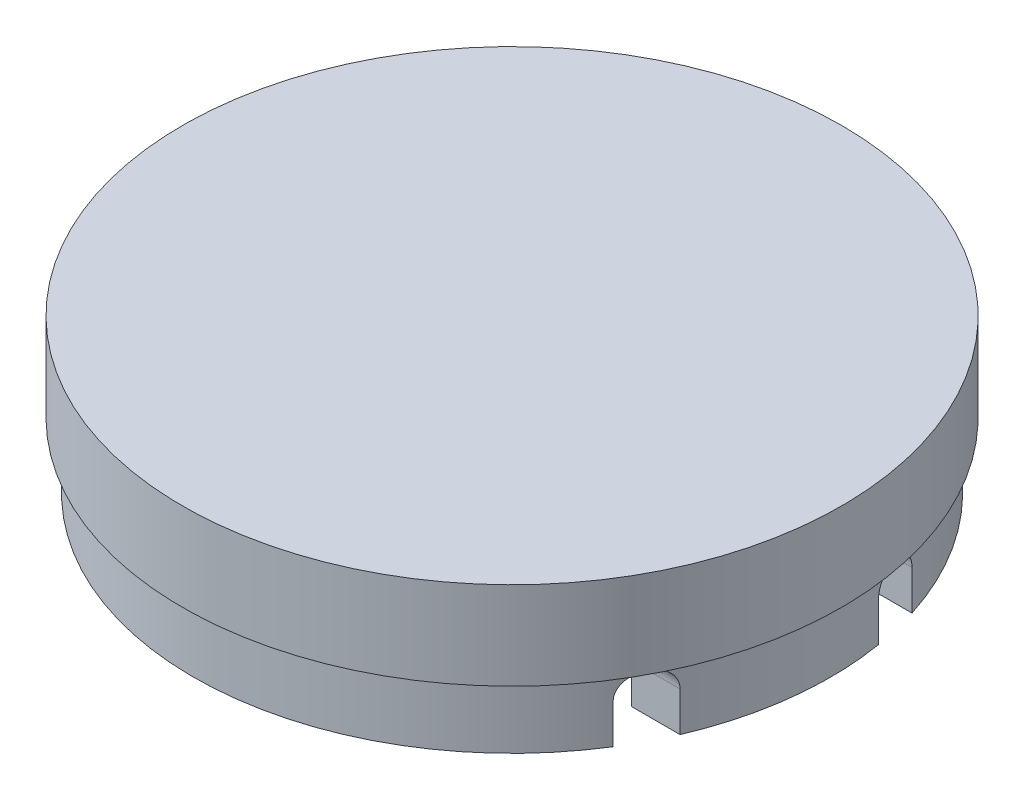
ISO-10303-21;
HEADER;
FILE_DESCRIPTION(('STEP AP214'),'2;1');
FILE_NAME('part.step','',(''),(''),'','','');
FILE_SCHEMA(('AUTOMOTIVE_DESIGN { 1 0 10303 214 1 1 1 1 }'));
ENDSEC;
DATA;
#1=APPLICATION_CONTEXT('core data for automotive mechanical design processes');
#2=APPLICATION_PROTOCOL_DEFINITION('international standard','automotive_design',2000,#1);
#3=PRODUCT_CONTEXT('',#1,'mechanical');
#4=PRODUCT('Part','Part','',(#3));
#5=PRODUCT_RELATED_PRODUCT_CATEGORY('part','',(#4));
#6=PRODUCT_DEFINITION_FORMATION('','',#4);
#7=PRODUCT_DEFINITION_CONTEXT('part definition',#1,'design');
#8=PRODUCT_DEFINITION('design','',#6,#7);
#9=PRODUCT_DEFINITION_SHAPE('','',#8);
#10=(LENGTH_UNIT() NAMED_UNIT(*) SI_UNIT(.MILLI.,.METRE.));
#11=(NAMED_UNIT(*) PLANE_ANGLE_UNIT() SI_UNIT($,.RADIAN.));
#12=(NAMED_UNIT(*) SI_UNIT($,.STERADIAN.) SOLID_ANGLE_UNIT());
#13=UNCERTAINTY_MEASURE_WITH_UNIT(LENGTH_MEASURE(1.E-05),#10,'distance_accuracy_value','');
#14=(GEOMETRIC_REPRESENTATION_CONTEXT(3) GLOBAL_UNCERTAINTY_ASSIGNED_CONTEXT((#13)) GLOBAL_UNIT_ASSIGNED_CONTEXT((#10,
#11,#12)) REPRESENTATION_CONTEXT('',''));
#15=CARTESIAN_POINT('',(0.,0.,0.));
#16=DIRECTION('',(0.,0.,1.));
#17=DIRECTION('',(1.,0.,0.));
#18=AXIS2_PLACEMENT_3D('',#15,#16,#17);
#19=CARTESIAN_POINT('',(0.,0.,0.));
#20=DIRECTION('',(0.,-1.,0.));
#21=DIRECTION('',(0.,0.,-1.));
#22=AXIS2_PLACEMENT_3D('',#19,#20,#21);
#23=PLANE('',#22);
#24=CARTESIAN_POINT('',(0.,0.,0.));
#25=DIRECTION('',(0.,-1.,0.));
#26=DIRECTION('',(0.,0.,-1.));
#27=AXIS2_PLACEMENT_3D('',#24,#25,#26);
#28=CIRCLE('',#27,92.075);
#29=CARTESIAN_POINT('',(78.0603424756711,0.,48.8302012854845));
#30=VERTEX_POINT('',#29);
#31=CARTESIAN_POINT('',(87.7774272459443,0.,-27.8015987145155));
#32=VERTEX_POINT('',#31);
#33=EDGE_CURVE('E11',#30,#32,#28,.T.);
#34=ORIENTED_EDGE('',*,*,#33,.T.);
#35=DIRECTION('',(1.,0.,0.));
#36=VECTOR('',#35,1.);
#37=CARTESIAN_POINT('',(95.251,0.,-27.8015987145155));
#38=LINE('',#37,#36);
#39=CARTESIAN_POINT('',(74.3469013067596,0.,-27.8015987145155));
#40=VERTEX_POINT('',#39);
#41=EDGE_CURVE('E101',#40,#32,#38,.T.);
#42=ORIENTED_EDGE('',*,*,#41,.F.);
#43=CARTESIAN_POINT('',(0.,0.,0.));
#44=DIRECTION('',(0.,-1.,0.));
#45=DIRECTION('',(0.,0.,-1.));
#46=AXIS2_PLACEMENT_3D('',#43,#44,#45);
#47=CIRCLE('',#46,79.375);
#48=CARTESIAN_POINT('',(62.5779679073959,0.,48.8302012854845));
#49=VERTEX_POINT('',#48);
#50=EDGE_CURVE('E113',#49,#40,#47,.T.);
#51=ORIENTED_EDGE('',*,*,#50,.F.);
#52=DIRECTION('',(-1.,0.,0.));
#53=VECTOR('',#52,1.);
#54=CARTESIAN_POINT('',(95.251,0.,48.8302012854845));
#55=LINE('',#54,#53);
#56=EDGE_CURVE('E56',#30,#49,#55,.T.);
#57=ORIENTED_EDGE('',*,*,#56,.F.);
#58=EDGE_LOOP('',(#34,#42,#51,#57));
#59=FACE_BOUND('',#58,.T.);
#60=ADVANCED_FACE('F34',(#59),#23,.T.);
#61=CARTESIAN_POINT('',(77.9251714227549,0.,-15.1015987145155));
#62=VERTEX_POINT('',#61);
#63=CARTESIAN_POINT('',(70.6753081356592,0.,36.1302012854845));
#64=VERTEX_POINT('',#63);
#65=EDGE_CURVE('E122',#62,#64,#47,.T.);
#66=ORIENTED_EDGE('',*,*,#65,.F.);
#67=DIRECTION('',(-1.,0.,0.));
#68=VECTOR('',#67,1.);
#69=CARTESIAN_POINT('',(95.251,0.,-15.1015987145155));
#70=LINE('',#69,#68);
#71=CARTESIAN_POINT('',(90.8281197717191,0.,-15.1015987145155));
#72=VERTEX_POINT('',#71);
#73=EDGE_CURVE('E48',#72,#62,#70,.T.);
#74=ORIENTED_EDGE('',*,*,#73,.F.);
#75=CARTESIAN_POINT('',(84.6901067425846,0.,36.1302012854845));
#76=VERTEX_POINT('',#75);
#77=EDGE_CURVE('E41',#72,#76,#28,.T.);
#78=ORIENTED_EDGE('',*,*,#77,.T.);
#79=DIRECTION('',(1.,0.,0.));
#80=VECTOR('',#79,1.);
#81=CARTESIAN_POINT('',(95.251,0.,36.1302012854845));
#82=LINE('',#81,#80);
#83=EDGE_CURVE('E142',#64,#76,#82,.T.);
#84=ORIENTED_EDGE('',*,*,#83,.F.);
#85=EDGE_LOOP('',(#66,#74,#78,#84));
#86=FACE_BOUND('',#85,.T.);
#87=ADVANCED_FACE('F141',(#86),#23,.T.);
#88=CARTESIAN_POINT('',(0.,0.,0.));
#89=DIRECTION('',(0.,-1.,0.));
#90=DIRECTION('',(0.,0.,-1.));
#91=AXIS2_PLACEMENT_3D('',#88,#89,#90);
#92=CYLINDRICAL_SURFACE('',#91,92.075);
#93=CARTESIAN_POINT('',(0.,19.05,0.));
#94=DIRECTION('',(0.,-1.,0.));
#95=DIRECTION('',(0.,0.,-1.));
#96=AXIS2_PLACEMENT_3D('',#93,#94,#95);
#97=CIRCLE('',#96,92.075);
#98=CARTESIAN_POINT('',(0.,19.05,-92.075));
#99=VERTEX_POINT('',#98);
#100=EDGE_CURVE('E132',#99,#99,#97,.T.);
#101=ORIENTED_EDGE('',*,*,#100,.T.);
#102=EDGE_LOOP('',(#101));
#103=FACE_BOUND('',#102,.T.);
#104=CARTESIAN_POINT('',(87.7774272459444,11.43,-27.8015987145155));
#105=CARTESIAN_POINT('',(87.7774159058502,11.6029773225166,-27.801622050643));
#106=CARTESIAN_POINT('',(87.7796654334244,11.7759480728997,-27.7945317603055));
#107=CARTESIAN_POINT('',(87.7886034667052,12.1205957592313,-27.7662948665976));
#108=CARTESIAN_POINT('',(87.7952912523624,12.2922729004826,-27.7451505433095));
#109=CARTESIAN_POINT('',(87.8130040535642,12.6327436287871,-27.6890367419301));
#110=CARTESIAN_POINT('',(87.8240197235096,12.8015426168132,-27.6540970526421));
#111=CARTESIAN_POINT('',(87.8502318215,13.1354393469028,-27.5707147996241));
#112=CARTESIAN_POINT('',(87.8654282941223,13.3005370494816,-27.52227209192));
#113=CARTESIAN_POINT('',(87.8997915995888,13.6258394943117,-27.4123251644539));
#114=CARTESIAN_POINT('',(87.9189572319075,13.7860456992887,-27.3508248939851));
#115=CARTESIAN_POINT('',(87.9610180893906,14.1006068106164,-27.2152523058838));
#116=CARTESIAN_POINT('',(87.9839146932102,14.254959527918,-27.1411753405304));
#117=CARTESIAN_POINT('',(88.0331401283024,14.5567342629933,-26.9810835920225));
#118=CARTESIAN_POINT('',(88.0594683799104,14.7041574455755,-26.8950708248727));
#119=CARTESIAN_POINT('',(88.1152538385358,14.9912462185714,-26.7117361240038));
#120=CARTESIAN_POINT('',(88.1447122253705,15.1309088534399,-26.6144099246931));
#121=CARTESIAN_POINT('',(88.2070967866769,15.4045915555596,-26.4069250606313));
#122=CARTESIAN_POINT('',(88.2400853250482,15.5384180890382,-26.2965298861126));
#123=CARTESIAN_POINT('',(88.3086091261689,15.7962915128639,-26.0654886728753));
#124=CARTESIAN_POINT('',(88.3441453161818,15.9203348075738,-25.9448388988162));
#125=CARTESIAN_POINT('',(88.4173681220934,16.1578620637483,-25.6941954358871));
#126=CARTESIAN_POINT('',(88.4550544735034,16.2713473194459,-25.5642028957508));
#127=CARTESIAN_POINT('',(88.5322133009518,16.4871811461961,-25.2956982615994));
#128=CARTESIAN_POINT('',(88.5716864419185,16.5895255222801,-25.1571829889659));
#129=CARTESIAN_POINT('',(88.6537060817536,16.7864982018879,-24.8666391598918));
#130=CARTESIAN_POINT('',(88.6963120896942,16.8806260055819,-24.7142878692818));
#131=CARTESIAN_POINT('',(88.7826336870014,17.0556044364281,-24.4023722980746));
#132=CARTESIAN_POINT('',(88.8263496630971,17.1364503606077,-24.2428054879333));
#133=CARTESIAN_POINT('',(88.914467567013,17.2843364855654,-23.9175972345723));
#134=CARTESIAN_POINT('',(88.9588694385033,17.3513778136476,-23.7519562886783));
#135=CARTESIAN_POINT('',(89.0479727252286,17.4712512965294,-23.4156877366158));
#136=CARTESIAN_POINT('',(89.0926741447528,17.524083247416,-23.2450600589237));
#137=CARTESIAN_POINT('',(89.1832139334126,17.6164290330638,-22.8952721120052));
#138=CARTESIAN_POINT('',(89.2290503511205,17.6555439836108,-22.7160058836635));
#139=CARTESIAN_POINT('',(89.320251203974,17.7181231258022,-22.3547098216815));
#140=CARTESIAN_POINT('',(89.3656157910972,17.7415925209261,-22.1726809274834));
#141=CARTESIAN_POINT('',(89.4555529692983,17.7727027556085,-21.8069973702445));
#142=CARTESIAN_POINT('',(89.5001252182054,17.7803369138262,-21.6233420537768));
#143=CARTESIAN_POINT('',(89.5881120879099,17.7796404133045,-21.2558575492247));
#144=CARTESIAN_POINT('',(89.6315271481618,17.7713159052089,-21.0720284554083));
#145=CARTESIAN_POINT('',(89.7169417961548,17.7386851718427,-20.7053480460103));
#146=CARTESIAN_POINT('',(89.7589405548451,17.7143697511184,-20.5224973540787));
#147=CARTESIAN_POINT('',(89.8412099761212,17.6498443555464,-20.1592974595501));
#148=CARTESIAN_POINT('',(89.8814812647037,17.6096401932977,-19.9789473671019));
#149=CARTESIAN_POINT('',(89.9600765145855,17.5135272147936,-19.6220197364076));
#150=CARTESIAN_POINT('',(89.9984002341428,17.4576164545522,-19.4454426680568));
#151=CARTESIAN_POINT('',(90.0728844892626,17.3304085779802,-19.0974544475254));
#152=CARTESIAN_POINT('',(90.1090451167968,17.259112116422,-18.9260430758608));
#153=CARTESIAN_POINT('',(90.1783601929469,17.10307179756,-18.592938748421));
#154=CARTESIAN_POINT('',(90.2115587744235,17.0186098670714,-18.4311228860619));
#155=CARTESIAN_POINT('',(90.2755653306973,16.8358365828349,-18.1150196226213));
#156=CARTESIAN_POINT('',(90.3063734039383,16.7375257998671,-17.9607319116198));
#157=CARTESIAN_POINT('',(90.3654911963782,16.5276957929002,-17.6608885174689));
#158=CARTESIAN_POINT('',(90.3938007374513,16.4161756285001,-17.5153334571261));
#159=CARTESIAN_POINT('',(90.4478230736426,16.1807464546504,-17.2341931204911));
#160=CARTESIAN_POINT('',(90.4735369135843,16.0568424702353,-17.0986038387899));
#161=CARTESIAN_POINT('',(90.5217648945671,15.8004355626413,-16.8413907413855));
#162=CARTESIAN_POINT('',(90.5443384074261,15.6681916030377,-16.7195198206864));
#163=CARTESIAN_POINT('',(90.5869120150263,15.3936487220564,-16.4872960519546));
#164=CARTESIAN_POINT('',(90.6069130795319,15.2513536212942,-16.3769388664412));
#165=CARTESIAN_POINT('',(90.6443363988574,14.9576126929604,-16.1685226073644));
#166=CARTESIAN_POINT('',(90.6617575492904,14.8061629854045,-16.0704688032511));
#167=CARTESIAN_POINT('',(90.6939994952155,14.4952662292374,-15.8875018271758));
#168=CARTESIAN_POINT('',(90.7088203918952,14.335819492137,-15.802588143888));
#169=CARTESIAN_POINT('',(90.7356436248908,14.0127066958505,-15.647832825724));
#170=CARTESIAN_POINT('',(90.7476873698687,13.8491493855031,-15.5777712181648));
#171=CARTESIAN_POINT('',(90.769259775502,13.5165897426794,-15.4515761651176));
#172=CARTESIAN_POINT('',(90.7787885181242,13.3475875878584,-15.3954422657127));
#173=CARTESIAN_POINT('',(90.7953271283391,13.0055748761487,-15.2976029921785));
#174=CARTESIAN_POINT('',(90.8023401933654,12.8325697071235,-15.2558793051552));
#175=CARTESIAN_POINT('',(90.8138686366863,12.4836563984965,-15.1871033049781));
#176=CARTESIAN_POINT('',(90.8183852269397,12.3077497102805,-15.1600438729217));
#177=CARTESIAN_POINT('',(90.8238142062272,12.0145707439693,-15.1274772230202));
#178=CARTESIAN_POINT('',(90.8254304566654,11.8977613636911,-15.1177670653845));
#179=CARTESIAN_POINT('',(90.8275821674246,11.6639719267477,-15.1048321754587));
#180=CARTESIAN_POINT('',(90.8281194467414,11.5469924906082,-15.1015965280753));
#181=CARTESIAN_POINT('',(90.8281197717191,11.43,-15.1015987145155));
#182=B_SPLINE_CURVE_WITH_KNOTS('',3,(#104,#105,#106,#107,#108,#109,#110,#111,#112,#113,#114,
#115,#116,#117,#118,#119,#120,#121,#122,#123,#124,#125,#126,#127,#128,#129,#130,#131,#132,#133,
#134,#135,#136,#137,#138,#139,#140,#141,#142,#143,#144,#145,#146,#147,#148,#149,#150,#151,#152,
#153,#154,#155,#156,#157,#158,#159,#160,#161,#162,#163,#164,#165,#166,#167,#168,#169,#170,#171,
#172,#173,#174,#175,#176,#177,#178,#179,#180,#181),.UNSPECIFIED.,.F.,.F.,(4,2,2,2,2,2,2,2,2,2,2,
2,2,2,2,2,2,2,2,2,2,2,2,2,2,2,2,2,2,2,2,2,2,2,2,2,2,2,4),(0.,0.518762110680606,1.03744007955425,
1.55500412148674,2.07257368209039,2.58998692489126,3.10759179575847,3.62510934725822,
4.14282265921749,4.67200460192008,5.20138013739801,5.73069069484398,6.26019987359708,
6.81181479573645,7.36362461983603,7.91538936442865,8.4671620267529,9.03385918118179,
9.60036776638743,10.1671153292367,10.7336445053148,11.3004997449165,11.8671478028028,
12.4338660249301,13.0005601338708,13.5564629181198,14.1123427975465,14.6682622749273,
15.2239570833521,15.7670406989817,16.3099189785041,16.8530289809784,17.3961178439234,
17.9304927573558,18.4648502527321,18.9985261513961,19.531942739384,19.8834414350701,
20.2343470535552),.UNSPECIFIED.);
#183=CARTESIAN_POINT('',(87.7774272459444,11.43,-27.8015987145155));
#184=VERTEX_POINT('',#183);
#185=CARTESIAN_POINT('',(90.8281197717191,11.43,-15.1015987145155));
#186=VERTEX_POINT('',#185);
#187=EDGE_CURVE('E108',#184,#186,#182,.T.);
#188=ORIENTED_EDGE('',*,*,#187,.F.);
#189=DIRECTION('',(0.,-1.,0.));
#190=VECTOR('',#189,1.);
#191=CARTESIAN_POINT('',(87.7774272459444,0.,-27.8015987145155));
#192=LINE('',#191,#190);
#193=EDGE_CURVE('E116',#32,#184,#192,.F.);
#194=ORIENTED_EDGE('',*,*,#193,.F.);
#195=ORIENTED_EDGE('',*,*,#33,.F.);
#196=DIRECTION('',(0.,-1.,0.));
#197=VECTOR('',#196,1.);
#198=CARTESIAN_POINT('',(78.0603424756711,0.,48.8302012854845));
#199=LINE('',#198,#197);
#200=CARTESIAN_POINT('',(78.0603424756711,11.43,48.8302012854845));
#201=VERTEX_POINT('',#200);
#202=EDGE_CURVE('E175',#201,#30,#199,.T.);
#203=ORIENTED_EDGE('',*,*,#202,.F.);
#204=CARTESIAN_POINT('',(84.6901067425846,11.43,36.1302012854845));
#205=CARTESIAN_POINT('',(84.6901137409722,11.5977208667609,36.1301757821111));
#206=CARTESIAN_POINT('',(84.6872722652147,11.7654347258229,36.1368451047794));
#207=CARTESIAN_POINT('',(84.6759438180474,12.0995924007407,36.1633868311557));
#208=CARTESIAN_POINT('',(84.667457890509,12.2660364456771,36.1832567935683));
#209=CARTESIAN_POINT('',(84.6449214276481,12.5960298686397,36.2359444578249));
#210=CARTESIAN_POINT('',(84.6308854844793,12.7595856717843,36.2687282057677));
#211=CARTESIAN_POINT('',(84.5973459314827,13.0830860049913,36.3468912699654));
#212=CARTESIAN_POINT('',(84.5778422481335,13.2430304864631,36.3922707555875));
#213=CARTESIAN_POINT('',(84.5335060137548,13.5581401466733,36.4951382328827));
#214=CARTESIAN_POINT('',(84.508675632742,13.7133072422985,36.5526212935654));
#215=CARTESIAN_POINT('',(84.4538335664886,14.0179671080252,36.6791544946991));
#216=CARTESIAN_POINT('',(84.4238199641406,14.1674577535444,36.7482089147436));
#217=CARTESIAN_POINT('',(84.358812905996,14.4597580666483,36.8971938027775));
#218=CARTESIAN_POINT('',(84.3238200680602,14.6025685602391,36.9771229212992));
#219=CARTESIAN_POINT('',(84.2490541630516,14.8807540208444,37.1471549737523));
#220=CARTESIAN_POINT('',(84.2092792864852,15.0161261448167,37.2372617580634));
#221=CARTESIAN_POINT('',(84.1240107295478,15.2823597148727,37.429504481497));
#222=CARTESIAN_POINT('',(84.0783874335399,15.4129863905716,37.5319079381773));
#223=CARTESIAN_POINT('',(83.9826096139402,15.6649328973653,37.7457366278474));
#224=CARTESIAN_POINT('',(83.9324534594863,15.7862493495035,37.8571651064111));
#225=CARTESIAN_POINT('',(83.827920808011,16.018963093751,38.0880738861367));
#226=CARTESIAN_POINT('',(83.7735447291174,16.1303613662524,38.2075533894153));
#227=CARTESIAN_POINT('',(83.6608529113161,16.3428494102414,38.4536818393005));
#228=CARTESIAN_POINT('',(83.6025356937765,16.4439352766364,38.5803334738187));
#229=CARTESIAN_POINT('',(83.4777534503464,16.6426314355338,38.8496322468782));
#230=CARTESIAN_POINT('',(83.4110055686618,16.7394065482879,38.9927656707854));
#231=CARTESIAN_POINT('',(83.2737181461393,16.9203062603032,39.2851071936179));
#232=CARTESIAN_POINT('',(83.2031772066253,17.0044261489671,39.4343175283934));
#233=CARTESIAN_POINT('',(82.9864744519911,17.2374224738038,39.889385878747));
#234=CARTESIAN_POINT('',(82.8351503535765,17.3670657898607,40.2028595904942));
#235=CARTESIAN_POINT('',(82.5074504512995,17.5838195412887,40.8714765416195));
#236=CARTESIAN_POINT('',(82.3300567332288,17.6657893890138,41.2277676445074));
#237=CARTESIAN_POINT('',(81.9669555764157,17.7677728821678,41.9450298689416));
#238=CARTESIAN_POINT('',(81.7812444645249,17.7877588749052,42.30600300718));
#239=CARTESIAN_POINT('',(81.3896956060473,17.7659652091397,43.0548077269151));
#240=CARTESIAN_POINT('',(81.1834962480651,17.7187494180664,43.4422920446259));
#241=CARTESIAN_POINT('',(80.771848788851,17.5542127158928,44.202951487552));
#242=CARTESIAN_POINT('',(80.5664010202863,17.4368638335824,44.5761208402964));
#243=CARTESIAN_POINT('',(80.2602452787969,17.2071768247318,45.1236626938923));
#244=CARTESIAN_POINT('',(80.1567496500273,17.1196476208856,45.307216894384));
#245=CARTESIAN_POINT('',(79.952715438653,16.9266116209853,45.6663050179662));
#246=CARTESIAN_POINT('',(79.8521756047379,16.8211125646622,45.8418423528675));
#247=CARTESIAN_POINT('',(79.6550556005463,16.5923924412771,46.1835111824462));
#248=CARTESIAN_POINT('',(79.5584776637272,16.4691615499145,46.3496373913156));
#249=CARTESIAN_POINT('',(79.3705652551048,16.2054993112442,46.6706927356603));
#250=CARTESIAN_POINT('',(79.2792277720844,16.0650779900929,46.8256283149066));
#251=CARTESIAN_POINT('',(79.1081135973413,15.7761158343376,47.1141007176458));
#252=CARTESIAN_POINT('',(79.0279740666896,15.628507942544,47.2483559789009));
#253=CARTESIAN_POINT('',(78.874672056968,15.3191967656954,47.5038305243922));
#254=CARTESIAN_POINT('',(78.8015054772706,15.1575018733175,47.6250574756926));
#255=CARTESIAN_POINT('',(78.663370559467,14.8208964727871,47.8528735593858));
#256=CARTESIAN_POINT('',(78.5983995031237,14.6459903773748,47.959467546185));
#257=CARTESIAN_POINT('',(78.4779267557475,14.2841607382626,48.1563492012212));
#258=CARTESIAN_POINT('',(78.4224225111779,14.0972404540075,48.246641267054));
#259=CARTESIAN_POINT('',(78.3293975429437,13.7408325452328,48.3974977145882));
#260=CARTESIAN_POINT('',(78.2904366618205,13.5727379822544,48.4604733264682));
#261=CARTESIAN_POINT('',(78.2210842063766,13.2302258858043,48.572337286986));
#262=CARTESIAN_POINT('',(78.1906906548455,13.0558098217437,48.621228886059));
#263=CARTESIAN_POINT('',(78.1391589069556,12.7026401402812,48.7040023542306));
#264=CARTESIAN_POINT('',(78.1179951636199,12.523899959604,48.7379256568402));
#265=CARTESIAN_POINT('',(78.0852749096211,12.1634025547692,48.7903313686825));
#266=CARTESIAN_POINT('',(78.0737102747309,11.9816480150001,48.8088268353644));
#267=CARTESIAN_POINT('',(78.0648248311864,11.7378395726919,48.8230351008349));
#268=CARTESIAN_POINT('',(78.063143442686,11.676275636652,48.8257233784434));
#269=CARTESIAN_POINT('',(78.06090306377,11.5531442922259,48.8293051787877));
#270=CARTESIAN_POINT('',(78.0603428168201,11.4915769651516,48.8302007107676));
#271=CARTESIAN_POINT('',(78.0603424756711,11.43,48.8302012854845));
#272=B_SPLINE_CURVE_WITH_KNOTS('',3,(#204,#205,#206,#207,#208,#209,#210,#211,#212,#213,#214,
#215,#216,#217,#218,#219,#220,#221,#222,#223,#224,#225,#226,#227,#228,#229,#230,#231,#232,#233,
#234,#235,#236,#237,#238,#239,#240,#241,#242,#243,#244,#245,#246,#247,#248,#249,#250,#251,#252,
#253,#254,#255,#256,#257,#258,#259,#260,#261,#262,#263,#264,#265,#266,#267,#268,#269,#270,#271),
.UNSPECIFIED.,.F.,.F.,(4,2,2,2,2,2,2,2,2,2,2,2,2,2,2,2,2,2,2,2,2,2,2,2,2,2,2,2,2,2,2,2,2,4),(0.,
0.502995314246474,1.00589763159632,1.50748641270473,2.00908193869878,2.51047350894982,
3.01205092661842,3.51356615899938,4.01527176243305,4.5311219913415,5.04715856082875,
5.56314406437706,6.0793242411738,6.63438115077056,7.18964415822249,8.29947072606037,
9.51357070101131,10.7282122412785,12.0468745788521,13.3660631903724,14.0498771772711,
14.7333973824018,15.4172977597324,16.1008011421399,16.7449523264619,17.3887223324871,
18.0322782525325,18.6756603071124,19.2259131583491,19.7760389153501,20.3246321754179,
20.8727606575466,21.0576706136962,21.2423732132098),.UNSPECIFIED.);
#273=CARTESIAN_POINT('',(84.6901067425846,11.43,36.1302012854845));
#274=VERTEX_POINT('',#273);
#275=EDGE_CURVE('E160',#274,#201,#272,.T.);
#276=ORIENTED_EDGE('',*,*,#275,.F.);
#277=DIRECTION('',(0.,-1.,0.));
#278=VECTOR('',#277,1.);
#279=CARTESIAN_POINT('',(84.6901067425846,0.,36.1302012854845));
#280=LINE('',#279,#278);
#281=EDGE_CURVE('E150',#76,#274,#280,.F.);
#282=ORIENTED_EDGE('',*,*,#281,.F.);
#283=ORIENTED_EDGE('',*,*,#77,.F.);
#284=DIRECTION('',(0.,-1.,0.));
#285=VECTOR('',#284,1.);
#286=CARTESIAN_POINT('',(90.8281197717191,0.,-15.1015987145155));
#287=LINE('',#286,#285);
#288=EDGE_CURVE('E289',#186,#72,#287,.T.);
#289=ORIENTED_EDGE('',*,*,#288,.F.);
#290=EDGE_LOOP('',(#188,#194,#195,#203,#276,#282,#283,#289));
#291=FACE_BOUND('',#290,.T.);
#292=ADVANCED_FACE('F158',(#103,#291),#92,.T.);
#293=CARTESIAN_POINT('',(0.,0.,0.));
#294=DIRECTION('',(0.,-1.,0.));
#295=DIRECTION('',(0.,0.,-1.));
#296=AXIS2_PLACEMENT_3D('',#293,#294,#295);
#297=CYLINDRICAL_SURFACE('',#296,79.375);
#298=CARTESIAN_POINT('',(0.,31.75,0.));
#299=DIRECTION('',(0.,-1.,0.));
#300=DIRECTION('',(0.,0.,-1.));
#301=AXIS2_PLACEMENT_3D('',#298,#299,#300);
#302=CIRCLE('',#301,79.375);
#303=CARTESIAN_POINT('',(0.,31.75,-79.375));
#304=VERTEX_POINT('',#303);
#305=EDGE_CURVE('E127',#304,#304,#302,.T.);
#306=ORIENTED_EDGE('',*,*,#305,.F.);
#307=EDGE_LOOP('',(#306));
#308=FACE_BOUND('',#307,.T.);
#309=DIRECTION('',(0.,-1.,0.));
#310=VECTOR('',#309,1.);
#311=CARTESIAN_POINT('',(74.3469013067596,0.,-27.8015987145155));
#312=LINE('',#311,#310);
#313=CARTESIAN_POINT('',(74.3469013067596,11.43,-27.8015987145155));
#314=VERTEX_POINT('',#313);
#315=EDGE_CURVE('E98',#40,#314,#312,.F.);
#316=ORIENTED_EDGE('',*,*,#315,.T.);
#317=CARTESIAN_POINT('',(74.3469013067596,11.43,-27.8015987145155));
#318=CARTESIAN_POINT('',(74.3468874756544,11.6009900180554,-27.8016234002266));
#319=CARTESIAN_POINT('',(74.3494834110759,11.7719720795817,-27.7946933063725));
#320=CARTESIAN_POINT('',(74.3597935616423,12.1126357949829,-27.7671051014109));
#321=CARTESIAN_POINT('',(74.3675067301397,12.2823177076046,-27.7464497975723));
#322=CARTESIAN_POINT('',(74.3879231597044,12.6187225239997,-27.6916650564473));
#323=CARTESIAN_POINT('',(74.4006131808756,12.7854520619819,-27.6575713680263));
#324=CARTESIAN_POINT('',(74.4307937352514,13.1152320065115,-27.5762481213653));
#325=CARTESIAN_POINT('',(74.4482843607588,13.2782823422525,-27.5290183105525));
#326=CARTESIAN_POINT('',(74.4878087975161,13.5995018775673,-27.4218930081686));
#327=CARTESIAN_POINT('',(74.5098402638246,13.7576735482618,-27.3620040535157));
#328=CARTESIAN_POINT('',(74.5581610795767,14.0682496503733,-27.230060163605));
#329=CARTESIAN_POINT('',(74.5844520071697,14.2206519182828,-27.1580007187046));
#330=CARTESIAN_POINT('',(74.6409449055957,14.5186793298649,-27.0023483960114));
#331=CARTESIAN_POINT('',(74.6711467512729,14.6643046902068,-26.9187558872895));
#332=CARTESIAN_POINT('',(74.7351043139554,14.9479851321571,-26.7406761133825));
#333=CARTESIAN_POINT('',(74.768861379462,15.0860373108288,-26.6461847129246));
#334=CARTESIAN_POINT('',(74.8405850768792,15.3577425389629,-26.4440784310689));
#335=CARTESIAN_POINT('',(74.878647184283,15.4911418523255,-26.3361563546781));
#336=CARTESIAN_POINT('',(74.9576955520956,15.7483464924667,-26.1103201274234));
#337=CARTESIAN_POINT('',(74.9986828736169,15.8721483034582,-25.9924023477071));
#338=CARTESIAN_POINT('',(75.083126039674,16.1094409826063,-25.7474578505952));
#339=CARTESIAN_POINT('',(75.1265816543665,16.2229328082618,-25.6204319810417));
#340=CARTESIAN_POINT('',(75.2155437937866,16.4390788423312,-25.3580714859522));
#341=CARTESIAN_POINT('',(75.2610510458554,16.5417291634418,-25.2227339075122));
#342=CARTESIAN_POINT('',(75.3563318820124,16.7412001853152,-24.9366772701079));
#343=CARTESIAN_POINT('',(75.4062004901256,16.8373493865694,-24.7855212080528));
#344=CARTESIAN_POINT('',(75.5072470013578,17.016384469205,-24.4759634045376));
#345=CARTESIAN_POINT('',(75.558424957245,17.0992698150592,-24.3175613708537));
#346=CARTESIAN_POINT('',(75.6616326033033,17.2513364423332,-23.9945146702403));
#347=CARTESIAN_POINT('',(75.7136625461437,17.3205135756723,-23.8298681316361));
#348=CARTESIAN_POINT('',(75.818089800062,17.444712187707,-23.4955006560605));
#349=CARTESIAN_POINT('',(75.8704869890251,17.4997381619694,-23.325781349788));
#350=CARTESIAN_POINT('',(75.9772089661929,17.5971236167577,-22.9758360962647));
#351=CARTESIAN_POINT('',(76.031532114761,17.6389287071209,-22.7954550869217));
#352=CARTESIAN_POINT('',(76.1396584867595,17.706640646466,-22.4316523921122));
#353=CARTESIAN_POINT('',(76.1934618865365,17.7325530885532,-22.2482317997337));
#354=CARTESIAN_POINT('',(76.3001702904587,17.7682765115111,-21.8794765644382));
#355=CARTESIAN_POINT('',(76.3530748758208,17.7780801800126,-21.6941410906772));
#356=CARTESIAN_POINT('',(76.4575466734889,17.7814084519014,-21.3230234104805));
#357=CARTESIAN_POINT('',(76.5091144003531,17.7749394155594,-21.13724140693));
#358=CARTESIAN_POINT('',(76.6106442854559,17.7456519533714,-20.7662429359163));
#359=CARTESIAN_POINT('',(76.6606040833695,17.7228105441686,-20.5810276314506));
#360=CARTESIAN_POINT('',(76.7584929959619,17.6608035333003,-20.2128830828698));
#361=CARTESIAN_POINT('',(76.8064229095918,17.621644421226,-20.0299529596884));
#362=CARTESIAN_POINT('',(76.8999927261843,17.5271396315769,-19.6676577041775));
#363=CARTESIAN_POINT('',(76.9456319364958,17.4717890922572,-19.4882936599234));
#364=CARTESIAN_POINT('',(77.034327609046,17.3452061790316,-19.1346860070916));
#365=CARTESIAN_POINT('',(77.0773851548601,17.2739805282816,-18.9604402661491));
#366=CARTESIAN_POINT('',(77.1596579998068,17.1180473326063,-18.6227612800431));
#367=CARTESIAN_POINT('',(77.1989430649212,17.0337276833868,-18.4591658709372));
#368=CARTESIAN_POINT('',(77.2746819836549,16.8509158411746,-18.1394907212792));
#369=CARTESIAN_POINT('',(77.3111369520912,16.7524292728058,-17.9834080306571));
#370=CARTESIAN_POINT('',(77.3810932998844,16.5418885360876,-17.6799681392487));
#371=CARTESIAN_POINT('',(77.4145946265098,16.4298341255951,-17.5326110942573));
#372=CARTESIAN_POINT('',(77.4785334621886,16.1929197848891,-17.2478628947294));
#373=CARTESIAN_POINT('',(77.5089710468234,16.068060170728,-17.110471494368));
#374=CARTESIAN_POINT('',(77.5657941068716,15.8105368987852,-16.8509732636268));
#375=CARTESIAN_POINT('',(77.5922768685273,15.6782418352097,-16.7285217728471));
#376=CARTESIAN_POINT('',(77.6422418110018,15.4033842386061,-16.4950648839244));
#377=CARTESIAN_POINT('',(77.6657240561033,15.2608219256447,-16.3840592405769));
#378=CARTESIAN_POINT('',(77.7096606146432,14.966409333649,-16.1743857228893));
#379=CARTESIAN_POINT('',(77.7301142815811,14.8145570812707,-16.0757204835102));
#380=CARTESIAN_POINT('',(77.7679699157808,14.5026994316827,-15.8915801681142));
#381=CARTESIAN_POINT('',(77.7853720124028,14.3426943804527,-15.8061045329903));
#382=CARTESIAN_POINT('',(77.8167680516171,14.0193301590094,-15.6507947180872));
#383=CARTESIAN_POINT('',(77.8308288765067,13.856123505804,-15.5806563330527));
#384=CARTESIAN_POINT('',(77.8560288213809,13.5242136636251,-15.4542408017106));
#385=CARTESIAN_POINT('',(77.8671680649547,13.3555107074968,-15.3979630690736));
#386=CARTESIAN_POINT('',(77.8865182686696,13.0140460816225,-15.2997842991753));
#387=CARTESIAN_POINT('',(77.8947329474406,12.8412898659021,-15.2578650075216));
#388=CARTESIAN_POINT('',(77.9082571347524,12.4928301430402,-15.1886582989307));
#389=CARTESIAN_POINT('',(77.9135680497856,12.3171281053452,-15.16136379833));
#390=CARTESIAN_POINT('',(77.920014324839,12.0225642627139,-15.1281913574768));
#391=CARTESIAN_POINT('',(77.9219502226502,11.9041654530599,-15.1182134352511));
#392=CARTESIAN_POINT('',(77.9245274913922,11.6671817217699,-15.1049214854314));
#393=CARTESIAN_POINT('',(77.92517105077,11.5485974556587,-15.1015961923048));
#394=CARTESIAN_POINT('',(77.925171422755,11.43,-15.1015987145155));
#395=B_SPLINE_CURVE_WITH_KNOTS('',3,(#317,#318,#319,#320,#321,#322,#323,#324,#325,#326,#327,
#328,#329,#330,#331,#332,#333,#334,#335,#336,#337,#338,#339,#340,#341,#342,#343,#344,#345,#346,
#347,#348,#349,#350,#351,#352,#353,#354,#355,#356,#357,#358,#359,#360,#361,#362,#363,#364,#365,
#366,#367,#368,#369,#370,#371,#372,#373,#374,#375,#376,#377,#378,#379,#380,#381,#382,#383,#384,
#385,#386,#387,#388,#389,#390,#391,#392,#393,#394),.UNSPECIFIED.,.F.,.F.,(4,2,2,2,2,2,2,2,2,2,2,
2,2,2,2,2,2,2,2,2,2,2,2,2,2,2,2,2,2,2,2,2,2,2,2,2,2,2,4),(0.,0.512797785668364,1.02549071914895,
1.53682889040095,2.0481768940059,2.55926149040688,3.07053588079109,3.58179391361691,
4.09324657077835,4.61994238805792,5.1468302433308,5.67366911585717,6.20069625367694,
6.757934970376,7.31519617987198,7.87262575897583,8.42987803344295,9.00809415060879,
9.58610665902977,10.1643814763317,10.7424303070571,11.3212921895781,11.8999240766727,
12.4787298862579,13.0572910340989,13.6211735240636,14.1848327532332,14.7485020434151,
15.3121574247019,15.8580981551017,16.4040271873692,16.9500725897993,17.4960948390179,
18.0300372799352,18.5639571302865,19.0971956479224,19.6301756521428,19.986497447474,
20.3422153365886),.UNSPECIFIED.);
#396=CARTESIAN_POINT('',(77.9251714227549,11.43,-15.1015987145155));
#397=VERTEX_POINT('',#396);
#398=EDGE_CURVE('E109',#314,#397,#395,.T.);
#399=ORIENTED_EDGE('',*,*,#398,.T.);
#400=DIRECTION('',(0.,-1.,0.));
#401=VECTOR('',#400,1.);
#402=CARTESIAN_POINT('',(77.9251714227549,0.,-15.1015987145155));
#403=LINE('',#402,#401);
#404=EDGE_CURVE('E286',#397,#62,#403,.T.);
#405=ORIENTED_EDGE('',*,*,#404,.T.);
#406=ORIENTED_EDGE('',*,*,#65,.T.);
#407=DIRECTION('',(0.,-1.,0.));
#408=VECTOR('',#407,1.);
#409=CARTESIAN_POINT('',(70.6753081356592,0.,36.1302012854845));
#410=LINE('',#409,#408);
#411=CARTESIAN_POINT('',(70.6753081356592,11.43,36.1302012854845));
#412=VERTEX_POINT('',#411);
#413=EDGE_CURVE('E153',#64,#412,#410,.F.);
#414=ORIENTED_EDGE('',*,*,#413,.T.);
#415=CARTESIAN_POINT('',(70.6753081356592,11.43,36.1302012854845));
#416=CARTESIAN_POINT('',(70.6753176126556,11.5937874078842,36.1301739432093));
#417=CARTESIAN_POINT('',(70.6720691067804,11.7575662689843,36.1365369893788));
#418=CARTESIAN_POINT('',(70.6591260699185,12.083855072343,36.1618431445223));
#419=CARTESIAN_POINT('',(70.6494330677101,12.2463653063002,36.1807832699312));
#420=CARTESIAN_POINT('',(70.6237130074885,12.5684168418436,36.2309609318231));
#421=CARTESIAN_POINT('',(70.6077067497415,12.7279661094415,36.2621580838126));
#422=CARTESIAN_POINT('',(70.5694902006703,13.0435045171484,36.3364752452448));
#423=CARTESIAN_POINT('',(70.5472797642829,13.1994935739221,36.3795955334681));
#424=CARTESIAN_POINT('',(70.4968441325275,13.5067410113652,36.4772340310408));
#425=CARTESIAN_POINT('',(70.4686229458864,13.6580024682712,36.5317446434281));
#426=CARTESIAN_POINT('',(70.406358200787,13.95499105235,36.6516017335138));
#427=CARTESIAN_POINT('',(70.3723124745582,14.1007160942195,36.7169522453169));
#428=CARTESIAN_POINT('',(70.2986502897897,14.3857166037389,36.8577902615452));
#429=CARTESIAN_POINT('',(70.2590336200191,14.5249918265678,36.9332781503395));
#430=CARTESIAN_POINT('',(70.1744893473261,14.7963886568481,37.0936637491019));
#431=CARTESIAN_POINT('',(70.129559721495,14.9285075114141,37.1785650424524));
#432=CARTESIAN_POINT('',(70.0329297265526,15.18966869859,37.3602776154901));
#433=CARTESIAN_POINT('',(69.9810400044697,15.3184150425899,37.4574138966518));
#434=CARTESIAN_POINT('',(69.8722141912222,15.5669253044518,37.6600260949973));
#435=CARTESIAN_POINT('',(69.8152762929156,15.6866859770751,37.7655049971954));
#436=CARTESIAN_POINT('',(69.6374254036528,16.0317284900189,38.0930588185046));
#437=CARTESIAN_POINT('',(69.5094171186057,16.2429268878224,38.3263607214144));
#438=CARTESIAN_POINT('',(69.2235908541255,16.6445790013635,38.8404443186841));
#439=CARTESIAN_POINT('',(69.0640622231286,16.8306866771214,39.1236415591399));
#440=CARTESIAN_POINT('',(68.7294149062722,17.1529582138091,39.7085863727768));
#441=CARTESIAN_POINT('',(68.5542895104719,17.2891004486851,40.0103419125473));
#442=CARTESIAN_POINT('',(68.1686784856078,17.5259757567319,40.664279639386));
#443=CARTESIAN_POINT('',(67.9565427302695,17.6198965589142,41.0179535143532));
#444=CARTESIAN_POINT('',(67.5217645962585,17.7458695175169,41.7298001968213));
#445=CARTESIAN_POINT('',(67.2991171018432,17.7778912248582,42.0879751313123));
#446=CARTESIAN_POINT('',(66.8200855023256,17.7821555918431,42.844966965056));
#447=CARTESIAN_POINT('',(66.5629294849018,17.7465313295408,43.243343135087));
#448=CARTESIAN_POINT('',(66.0475548720334,17.6017263218583,44.0264794757828));
#449=CARTESIAN_POINT('',(65.7893355291773,17.4924794795002,44.4112270839902));
#450=CARTESIAN_POINT('',(65.3989404702952,17.2700575499952,44.982523338185));
#451=CARTESIAN_POINT('',(65.2642606803888,17.1825825068756,45.1776607846618));
#452=CARTESIAN_POINT('',(64.9980696262926,16.9873924657986,45.5598055845276));
#453=CARTESIAN_POINT('',(64.8665588393972,16.8796744402099,45.7468117166021));
#454=CARTESIAN_POINT('',(64.4791629741331,16.526462412103,46.2928261127239));
#455=CARTESIAN_POINT('',(64.2298004458719,16.2505672443807,46.6377249906901));
#456=CARTESIAN_POINT('',(63.8266733354614,15.7047719772846,47.1871795958454));
#457=CARTESIAN_POINT('',(63.665261309673,15.4533126980104,47.404501910433));
#458=CARTESIAN_POINT('',(63.4417103454997,15.0460004391026,47.7027828547689));
#459=CARTESIAN_POINT('',(63.3702979684225,14.905234453999,47.797579591044));
#460=CARTESIAN_POINT('',(63.234636960968,14.6140080847989,47.9769104965053));
#461=CARTESIAN_POINT('',(63.1703871899818,14.4635492502786,48.0614462998842));
#462=CARTESIAN_POINT('',(63.0598117739142,14.1785205324263,48.2064072092279));
#463=CARTESIAN_POINT('',(63.0122648528492,14.0452817860914,48.2685239073458));
#464=CARTESIAN_POINT('',(62.9236450107513,13.7729893229676,48.3839934257846));
#465=CARTESIAN_POINT('',(62.8825709312181,13.6339366523968,48.4373478144437));
#466=CARTESIAN_POINT('',(62.8075844905838,13.3508887614879,48.5345415660834));
#467=CARTESIAN_POINT('',(62.7736618916776,13.2069009544245,48.5783945334916));
#468=CARTESIAN_POINT('',(62.7134999307468,12.9147255880365,48.656037216591));
#469=CARTESIAN_POINT('',(62.6872584132142,12.7665392197634,48.6898297555415));
#470=CARTESIAN_POINT('',(62.6364210788042,12.422738000532,48.7552213995898));
#471=CARTESIAN_POINT('',(62.6145826964304,12.2260003466229,48.7832477831186));
#472=CARTESIAN_POINT('',(62.5926591107691,11.9287672400352,48.8113692849468));
#473=CARTESIAN_POINT('',(62.5871568578757,11.8292518613586,48.8184234996016));
#474=CARTESIAN_POINT('',(62.5798096371033,11.6298337141374,48.8278411419167));
#475=CARTESIAN_POINT('',(62.5779658168069,11.5299308338838,48.8302030977025));
#476=CARTESIAN_POINT('',(62.5779679073959,11.43,48.8302012854845));
#477=B_SPLINE_CURVE_WITH_KNOTS('',3,(#415,#416,#417,#418,#419,#420,#421,#422,#423,#424,#425,
#426,#427,#428,#429,#430,#431,#432,#433,#434,#435,#436,#437,#438,#439,#440,#441,#442,#443,#444,
#445,#446,#447,#448,#449,#450,#451,#452,#453,#454,#455,#456,#457,#458,#459,#460,#461,#462,#463,
#464,#465,#466,#467,#468,#469,#470,#471,#472,#473,#474,#475,#476),.UNSPECIFIED.,.F.,.F.,(4,2,2,
2,2,2,2,2,2,2,2,2,2,2,2,2,2,2,2,2,2,2,2,2,2,2,2,2,2,2,4),(0.,0.491193332437912,
0.982270184412946,1.47174242350157,1.96122610814638,2.45038435981566,2.93972506347715,
3.42908432623693,3.91863051619154,4.42633886723911,4.9342297068419,5.94941925740468,
7.06867852763811,8.18842166621156,9.45227724235038,10.7167543696601,12.1373160811727,
13.559154848502,14.3164581428288,15.0738747931113,16.5853399633006,17.6892730273229,
18.2410602283872,18.7927594342237,19.2558181024743,19.7187937987676,20.1811021460437,
20.6432806331072,21.2414853234955,21.541083958617,21.8407765574331),.UNSPECIFIED.);
#478=CARTESIAN_POINT('',(62.5779679073959,11.43,48.8302012854845));
#479=VERTEX_POINT('',#478);
#480=EDGE_CURVE('E291',#412,#479,#477,.T.);
#481=ORIENTED_EDGE('',*,*,#480,.T.);
#482=DIRECTION('',(0.,-1.,0.));
#483=VECTOR('',#482,1.);
#484=CARTESIAN_POINT('',(62.5779679073959,0.,48.8302012854845));
#485=LINE('',#484,#483);
#486=EDGE_CURVE('E120',#479,#49,#485,.T.);
#487=ORIENTED_EDGE('',*,*,#486,.T.);
#488=ORIENTED_EDGE('',*,*,#50,.T.);
#489=EDGE_LOOP('',(#316,#399,#405,#406,#414,#481,#487,#488));
#490=FACE_BOUND('',#489,.T.);
#491=ADVANCED_FACE('F118',(#308,#490),#297,.F.);
#492=CARTESIAN_POINT('',(92.075,19.05,0.));
#493=DIRECTION('',(0.,-1.,0.));
#494=DIRECTION('',(0.,0.,-1.));
#495=AXIS2_PLACEMENT_3D('',#492,#493,#494);
#496=PLANE('',#495);
#497=CARTESIAN_POINT('',(0.,19.05,0.));
#498=DIRECTION('',(0.,-1.,0.));
#499=DIRECTION('',(0.,0.,-1.));
#500=AXIS2_PLACEMENT_3D('',#497,#498,#499);
#501=CIRCLE('',#500,95.25);
#502=CARTESIAN_POINT('',(0.,19.05,-95.25));
#503=VERTEX_POINT('',#502);
#504=EDGE_CURVE('E125',#503,#503,#501,.T.);
#505=ORIENTED_EDGE('',*,*,#504,.T.);
#506=EDGE_LOOP('',(#505));
#507=FACE_BOUND('',#506,.T.);
#508=ORIENTED_EDGE('',*,*,#100,.F.);
#509=EDGE_LOOP('',(#508));
#510=FACE_BOUND('',#509,.T.);
#511=ADVANCED_FACE('F183',(#507,#510),#496,.T.);
#512=CARTESIAN_POINT('',(0.,0.,0.));
#513=DIRECTION('',(0.,-1.,0.));
#514=DIRECTION('',(0.,0.,-1.));
#515=AXIS2_PLACEMENT_3D('',#512,#513,#514);
#516=CYLINDRICAL_SURFACE('',#515,95.25);
#517=CARTESIAN_POINT('',(0.,44.45,0.));
#518=DIRECTION('',(0.,-1.,0.));
#519=DIRECTION('',(0.,0.,-1.));
#520=AXIS2_PLACEMENT_3D('',#517,#518,#519);
#521=CIRCLE('',#520,95.25);
#522=CARTESIAN_POINT('',(0.,44.45,-95.25));
#523=VERTEX_POINT('',#522);
#524=EDGE_CURVE('E121',#523,#523,#521,.T.);
#525=ORIENTED_EDGE('',*,*,#524,.T.);
#526=EDGE_LOOP('',(#525));
#527=FACE_BOUND('',#526,.T.);
#528=ORIENTED_EDGE('',*,*,#504,.F.);
#529=EDGE_LOOP('',(#528));
#530=FACE_BOUND('',#529,.T.);
#531=ADVANCED_FACE('F189',(#527,#530),#516,.T.);
#532=CARTESIAN_POINT('',(95.25,44.45,0.));
#533=DIRECTION('',(0.,1.,0.));
#534=DIRECTION('',(0.,0.,1.));
#535=AXIS2_PLACEMENT_3D('',#532,#533,#534);
#536=PLANE('',#535);
#537=ORIENTED_EDGE('',*,*,#524,.F.);
#538=EDGE_LOOP('',(#537));
#539=FACE_BOUND('',#538,.T.);
#540=ADVANCED_FACE('F304',(#539),#536,.T.);
#541=CARTESIAN_POINT('',(95.25,31.75,0.));
#542=DIRECTION('',(0.,1.,0.));
#543=DIRECTION('',(0.,0.,1.));
#544=AXIS2_PLACEMENT_3D('',#541,#542,#543);
#545=PLANE('',#544);
#546=ORIENTED_EDGE('',*,*,#305,.T.);
#547=EDGE_LOOP('',(#546));
#548=FACE_BOUND('',#547,.T.);
#549=ADVANCED_FACE('F180',(#548),#545,.F.);
#550=CARTESIAN_POINT('',(95.251,11.43,42.4802012854845));
#551=DIRECTION('',(-1.,0.,0.));
#552=DIRECTION('',(0.,0.,1.));
#553=AXIS2_PLACEMENT_3D('',#550,#551,#552);
#554=CYLINDRICAL_SURFACE('',#553,6.35000000000001);
#555=ORIENTED_EDGE('',*,*,#275,.T.);
#556=DIRECTION('',(-1.,0.,0.));
#557=VECTOR('',#556,1.);
#558=CARTESIAN_POINT('',(95.251,11.43,48.8302012854845));
#559=LINE('',#558,#557);
#560=EDGE_CURVE('E154',#201,#479,#559,.T.);
#561=ORIENTED_EDGE('',*,*,#560,.T.);
#562=ORIENTED_EDGE('',*,*,#480,.F.);
#563=DIRECTION('',(-1.,0.,0.));
#564=VECTOR('',#563,1.);
#565=CARTESIAN_POINT('',(95.251,11.43,36.1302012854845));
#566=LINE('',#565,#564);
#567=EDGE_CURVE('E172',#274,#412,#566,.T.);
#568=ORIENTED_EDGE('',*,*,#567,.F.);
#569=EDGE_LOOP('',(#555,#561,#562,#568));
#570=FACE_BOUND('',#569,.T.);
#571=ADVANCED_FACE('F214',(#570),#554,.F.);
#572=CARTESIAN_POINT('',(95.251,-11.43,36.1302012854845));
#573=DIRECTION('',(0.,0.,1.));
#574=DIRECTION('',(1.,0.,0.));
#575=AXIS2_PLACEMENT_3D('',#572,#573,#574);
#576=PLANE('',#575);
#577=ORIENTED_EDGE('',*,*,#281,.T.);
#578=ORIENTED_EDGE('',*,*,#567,.T.);
#579=ORIENTED_EDGE('',*,*,#413,.F.);
#580=ORIENTED_EDGE('',*,*,#83,.T.);
#581=EDGE_LOOP('',(#577,#578,#579,#580));
#582=FACE_BOUND('',#581,.T.);
#583=ADVANCED_FACE('F148',(#582),#576,.T.);
#584=CARTESIAN_POINT('',(95.251,-11.43,48.8302012854845));
#585=DIRECTION('',(0.,0.,-1.));
#586=DIRECTION('',(-1.,0.,0.));
#587=AXIS2_PLACEMENT_3D('',#584,#585,#586);
#588=PLANE('',#587);
#589=ORIENTED_EDGE('',*,*,#202,.T.);
#590=ORIENTED_EDGE('',*,*,#56,.T.);
#591=ORIENTED_EDGE('',*,*,#486,.F.);
#592=ORIENTED_EDGE('',*,*,#560,.F.);
#593=EDGE_LOOP('',(#589,#590,#591,#592));
#594=FACE_BOUND('',#593,.T.);
#595=ADVANCED_FACE('F229',(#594),#588,.T.);
#596=CARTESIAN_POINT('',(95.251,11.43,-21.4515987145155));
#597=DIRECTION('',(-1.,0.,0.));
#598=DIRECTION('',(0.,0.,1.));
#599=AXIS2_PLACEMENT_3D('',#596,#597,#598);
#600=CYLINDRICAL_SURFACE('',#599,6.35);
#601=ORIENTED_EDGE('',*,*,#187,.T.);
#602=DIRECTION('',(-1.,0.,0.));
#603=VECTOR('',#602,1.);
#604=CARTESIAN_POINT('',(95.251,11.43,-15.1015987145155));
#605=LINE('',#604,#603);
#606=EDGE_CURVE('E115',#186,#397,#605,.T.);
#607=ORIENTED_EDGE('',*,*,#606,.T.);
#608=ORIENTED_EDGE('',*,*,#398,.F.);
#609=DIRECTION('',(-1.,0.,0.));
#610=VECTOR('',#609,1.);
#611=CARTESIAN_POINT('',(95.251,11.43,-27.8015987145155));
#612=LINE('',#611,#610);
#613=EDGE_CURVE('E104',#184,#314,#612,.T.);
#614=ORIENTED_EDGE('',*,*,#613,.F.);
#615=EDGE_LOOP('',(#601,#607,#608,#614));
#616=FACE_BOUND('',#615,.T.);
#617=ADVANCED_FACE('F237',(#616),#600,.F.);
#618=CARTESIAN_POINT('',(95.251,-11.43,-27.8015987145155));
#619=DIRECTION('',(0.,0.,1.));
#620=DIRECTION('',(1.,0.,0.));
#621=AXIS2_PLACEMENT_3D('',#618,#619,#620);
#622=PLANE('',#621);
#623=ORIENTED_EDGE('',*,*,#193,.T.);
#624=ORIENTED_EDGE('',*,*,#613,.T.);
#625=ORIENTED_EDGE('',*,*,#315,.F.);
#626=ORIENTED_EDGE('',*,*,#41,.T.);
#627=EDGE_LOOP('',(#623,#624,#625,#626));
#628=FACE_BOUND('',#627,.T.);
#629=ADVANCED_FACE('F100',(#628),#622,.T.);
#630=CARTESIAN_POINT('',(95.251,-11.43,-15.1015987145155));
#631=DIRECTION('',(0.,0.,-1.));
#632=DIRECTION('',(-1.,0.,0.));
#633=AXIS2_PLACEMENT_3D('',#630,#631,#632);
#634=PLANE('',#633);
#635=ORIENTED_EDGE('',*,*,#288,.T.);
#636=ORIENTED_EDGE('',*,*,#73,.T.);
#637=ORIENTED_EDGE('',*,*,#404,.F.);
#638=ORIENTED_EDGE('',*,*,#606,.F.);
#639=EDGE_LOOP('',(#635,#636,#637,#638));
#640=FACE_BOUND('',#639,.T.);
#641=ADVANCED_FACE('F255',(#640),#634,.T.);
#642=CLOSED_SHELL('',(#60,#87,#292,#491,#511,#531,#540,#549,#571,#583,#595,#617,#629,#641));
#643=MANIFOLD_SOLID_BREP('B2',#642);
#644=ADVANCED_BREP_SHAPE_REPRESENTATION('',(#18,#643),#14);
#645=SHAPE_DEFINITION_REPRESENTATION(#9,#644);
ENDSEC;
END-ISO-10303-21;
